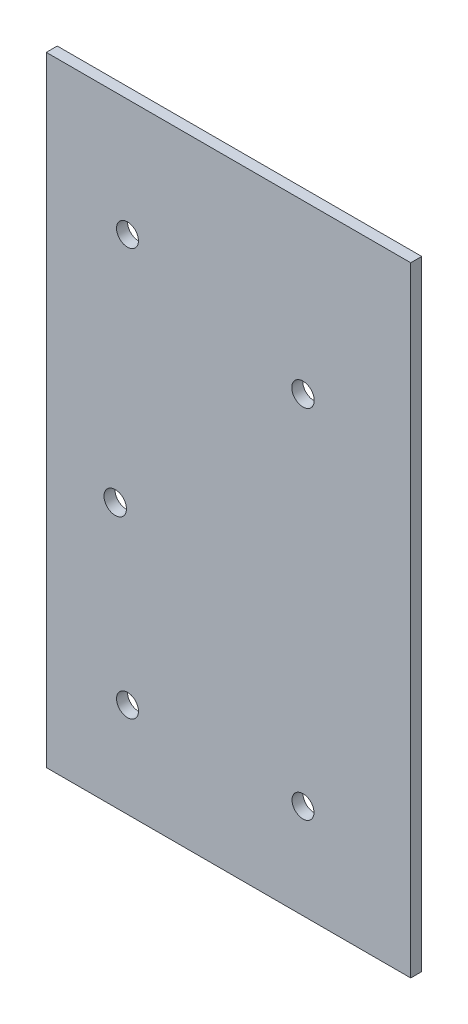
ISO-10303-21;
HEADER;
FILE_DESCRIPTION(('STEP AP214'),'2;1');
FILE_NAME('part.step','',(''),(''),'','','');
FILE_SCHEMA(('AUTOMOTIVE_DESIGN { 1 0 10303 214 1 1 1 1 }'));
ENDSEC;
DATA;
#1=APPLICATION_CONTEXT('core data for automotive mechanical design processes');
#2=APPLICATION_PROTOCOL_DEFINITION('international standard','automotive_design',2000,#1);
#3=PRODUCT_CONTEXT('',#1,'mechanical');
#4=PRODUCT('Part','Part','',(#3));
#5=PRODUCT_RELATED_PRODUCT_CATEGORY('part','',(#4));
#6=PRODUCT_DEFINITION_FORMATION('','',#4);
#7=PRODUCT_DEFINITION_CONTEXT('part definition',#1,'design');
#8=PRODUCT_DEFINITION('design','',#6,#7);
#9=PRODUCT_DEFINITION_SHAPE('','',#8);
#10=(LENGTH_UNIT() NAMED_UNIT(*) SI_UNIT(.MILLI.,.METRE.));
#11=(NAMED_UNIT(*) PLANE_ANGLE_UNIT() SI_UNIT($,.RADIAN.));
#12=(NAMED_UNIT(*) SI_UNIT($,.STERADIAN.) SOLID_ANGLE_UNIT());
#13=UNCERTAINTY_MEASURE_WITH_UNIT(LENGTH_MEASURE(1.E-05),#10,'distance_accuracy_value','');
#14=(GEOMETRIC_REPRESENTATION_CONTEXT(3) GLOBAL_UNCERTAINTY_ASSIGNED_CONTEXT((#13)) GLOBAL_UNIT_ASSIGNED_CONTEXT((#10,
#11,#12)) REPRESENTATION_CONTEXT('',''));
#15=CARTESIAN_POINT('',(0.,0.,0.));
#16=DIRECTION('',(0.,0.,1.));
#17=DIRECTION('',(1.,0.,0.));
#18=AXIS2_PLACEMENT_3D('',#15,#16,#17);
#19=CARTESIAN_POINT('',(0.,0.,3.175));
#20=DIRECTION('',(0.,0.,1.));
#21=DIRECTION('',(1.,0.,0.));
#22=AXIS2_PLACEMENT_3D('',#19,#20,#21);
#23=PLANE('',#22);
#24=CARTESIAN_POINT('',(76.1999999999999,162.306,3.175));
#25=DIRECTION('',(0.,0.,1.));
#26=DIRECTION('',(1.,0.,0.));
#27=AXIS2_PLACEMENT_3D('',#24,#25,#26);
#28=CIRCLE('',#27,3.25119999999999);
#29=CARTESIAN_POINT('',(79.4511999999999,162.306,3.175));
#30=VERTEX_POINT('',#29);
#31=EDGE_CURVE('E133',#30,#30,#28,.T.);
#32=ORIENTED_EDGE('',*,*,#31,.F.);
#33=EDGE_LOOP('',(#32));
#34=FACE_BOUND('',#33,.T.);
#35=CARTESIAN_POINT('',(76.1999999999998,58.9642857142862,3.175));
#36=DIRECTION('',(0.,0.,1.));
#37=DIRECTION('',(1.,0.,0.));
#38=AXIS2_PLACEMENT_3D('',#35,#36,#37);
#39=CIRCLE('',#38,3.175);
#40=CARTESIAN_POINT('',(79.3749999999998,58.9642857142862,3.175));
#41=VERTEX_POINT('',#40);
#42=EDGE_CURVE('E121',#41,#41,#39,.T.);
#43=ORIENTED_EDGE('',*,*,#42,.F.);
#44=EDGE_LOOP('',(#43));
#45=FACE_BOUND('',#44,.T.);
#46=DIRECTION('',(0.,-1.,0.));
#47=VECTOR('',#46,1.);
#48=CARTESIAN_POINT('',(1.88908690790865,210.816126932571,3.175));
#49=LINE('',#48,#47);
#50=CARTESIAN_POINT('',(1.88908690790865,210.816126932571,3.175));
#51=VERTEX_POINT('',#50);
#52=CARTESIAN_POINT('',(1.88908690790868,31.517256692789,3.175));
#53=VERTEX_POINT('',#52);
#54=EDGE_CURVE('E91',#51,#53,#49,.T.);
#55=ORIENTED_EDGE('',*,*,#54,.T.);
#56=DIRECTION('',(1.,0.,0.));
#57=VECTOR('',#56,1.);
#58=CARTESIAN_POINT('',(1.88908690790868,31.517256692789,3.175));
#59=LINE('',#58,#57);
#60=CARTESIAN_POINT('',(107.38691409108,31.517256692789,3.175));
#61=VERTEX_POINT('',#60);
#62=EDGE_CURVE('E86',#53,#61,#59,.T.);
#63=ORIENTED_EDGE('',*,*,#62,.T.);
#64=DIRECTION('',(0.,1.,0.));
#65=VECTOR('',#64,1.);
#66=CARTESIAN_POINT('',(107.38691409108,210.816126932571,3.175));
#67=LINE('',#66,#65);
#68=CARTESIAN_POINT('',(107.38691409108,210.816126932571,3.175));
#69=VERTEX_POINT('',#68);
#70=EDGE_CURVE('E89',#61,#69,#67,.T.);
#71=ORIENTED_EDGE('',*,*,#70,.T.);
#72=DIRECTION('',(-1.,0.,0.));
#73=VECTOR('',#72,1.);
#74=CARTESIAN_POINT('',(1.88908690790865,210.816126932571,3.175));
#75=LINE('',#74,#73);
#76=EDGE_CURVE('E56',#69,#51,#75,.T.);
#77=ORIENTED_EDGE('',*,*,#76,.T.);
#78=EDGE_LOOP('',(#55,#63,#71,#77));
#79=FACE_BOUND('',#78,.T.);
#80=CARTESIAN_POINT('',(25.3999999999998,58.9642857142856,3.175));
#81=DIRECTION('',(0.,0.,1.));
#82=DIRECTION('',(1.,0.,0.));
#83=AXIS2_PLACEMENT_3D('',#80,#81,#82);
#84=CIRCLE('',#83,3.175);
#85=CARTESIAN_POINT('',(28.5749999999998,58.9642857142856,3.175));
#86=VERTEX_POINT('',#85);
#87=EDGE_CURVE('E106',#86,#86,#84,.T.);
#88=ORIENTED_EDGE('',*,*,#87,.F.);
#89=EDGE_LOOP('',(#88));
#90=FACE_BOUND('',#89,.T.);
#91=CARTESIAN_POINT('',(25.3999999999994,176.892857142857,3.175));
#92=DIRECTION('',(0.,0.,1.));
#93=DIRECTION('',(1.,0.,0.));
#94=AXIS2_PLACEMENT_3D('',#91,#92,#93);
#95=CIRCLE('',#94,3.17500000000001);
#96=CARTESIAN_POINT('',(28.5749999999994,176.892857142857,3.175));
#97=VERTEX_POINT('',#96);
#98=EDGE_CURVE('E127',#97,#97,#95,.T.);
#99=ORIENTED_EDGE('',*,*,#98,.F.);
#100=EDGE_LOOP('',(#99));
#101=FACE_BOUND('',#100,.T.);
#102=CARTESIAN_POINT('',(21.8439999999999,107.95,3.175));
#103=DIRECTION('',(0.,0.,1.));
#104=DIRECTION('',(1.,0.,0.));
#105=AXIS2_PLACEMENT_3D('',#102,#103,#104);
#106=CIRCLE('',#105,3.25119999999999);
#107=CARTESIAN_POINT('',(25.0951999999999,107.95,3.175));
#108=VERTEX_POINT('',#107);
#109=EDGE_CURVE('E139',#108,#108,#106,.T.);
#110=ORIENTED_EDGE('',*,*,#109,.F.);
#111=EDGE_LOOP('',(#110));
#112=FACE_BOUND('',#111,.T.);
#113=ADVANCED_FACE('F39',(#34,#45,#79,#90,#101,#112),#23,.T.);
#114=CARTESIAN_POINT('',(0.,0.,0.));
#115=DIRECTION('',(0.,0.,1.));
#116=DIRECTION('',(1.,0.,0.));
#117=AXIS2_PLACEMENT_3D('',#114,#115,#116);
#118=PLANE('',#117);
#119=DIRECTION('',(0.,-1.,0.));
#120=VECTOR('',#119,1.);
#121=CARTESIAN_POINT('',(1.88908690790865,210.816126932571,0.));
#122=LINE('',#121,#120);
#123=CARTESIAN_POINT('',(1.88908690790865,210.816126932571,0.));
#124=VERTEX_POINT('',#123);
#125=CARTESIAN_POINT('',(1.88908690790868,31.517256692789,0.));
#126=VERTEX_POINT('',#125);
#127=EDGE_CURVE('E103',#124,#126,#122,.T.);
#128=ORIENTED_EDGE('',*,*,#127,.F.);
#129=DIRECTION('',(-1.,0.,0.));
#130=VECTOR('',#129,1.);
#131=CARTESIAN_POINT('',(1.88908690790865,210.816126932571,0.));
#132=LINE('',#131,#130);
#133=CARTESIAN_POINT('',(107.38691409108,210.816126932571,0.));
#134=VERTEX_POINT('',#133);
#135=EDGE_CURVE('E79',#134,#124,#132,.T.);
#136=ORIENTED_EDGE('',*,*,#135,.F.);
#137=DIRECTION('',(0.,1.,0.));
#138=VECTOR('',#137,1.);
#139=CARTESIAN_POINT('',(107.38691409108,210.816126932571,0.));
#140=LINE('',#139,#138);
#141=CARTESIAN_POINT('',(107.38691409108,31.517256692789,0.));
#142=VERTEX_POINT('',#141);
#143=EDGE_CURVE('E73',#142,#134,#140,.T.);
#144=ORIENTED_EDGE('',*,*,#143,.F.);
#145=DIRECTION('',(1.,0.,0.));
#146=VECTOR('',#145,1.);
#147=CARTESIAN_POINT('',(1.88908690790868,31.517256692789,0.));
#148=LINE('',#147,#146);
#149=EDGE_CURVE('E95',#126,#142,#148,.T.);
#150=ORIENTED_EDGE('',*,*,#149,.F.);
#151=EDGE_LOOP('',(#128,#136,#144,#150));
#152=FACE_BOUND('',#151,.T.);
#153=CARTESIAN_POINT('',(25.3999999999998,58.9642857142856,0.));
#154=DIRECTION('',(0.,0.,1.));
#155=DIRECTION('',(1.,0.,0.));
#156=AXIS2_PLACEMENT_3D('',#153,#154,#155);
#157=CIRCLE('',#156,3.175);
#158=CARTESIAN_POINT('',(28.5749999999998,58.9642857142856,0.));
#159=VERTEX_POINT('',#158);
#160=EDGE_CURVE('E118',#159,#159,#157,.T.);
#161=ORIENTED_EDGE('',*,*,#160,.T.);
#162=EDGE_LOOP('',(#161));
#163=FACE_BOUND('',#162,.T.);
#164=CARTESIAN_POINT('',(76.1999999999998,58.9642857142862,0.));
#165=DIRECTION('',(0.,0.,1.));
#166=DIRECTION('',(1.,0.,0.));
#167=AXIS2_PLACEMENT_3D('',#164,#165,#166);
#168=CIRCLE('',#167,3.175);
#169=CARTESIAN_POINT('',(79.3749999999998,58.9642857142862,0.));
#170=VERTEX_POINT('',#169);
#171=EDGE_CURVE('E124',#170,#170,#168,.T.);
#172=ORIENTED_EDGE('',*,*,#171,.T.);
#173=EDGE_LOOP('',(#172));
#174=FACE_BOUND('',#173,.T.);
#175=CARTESIAN_POINT('',(25.3999999999994,176.892857142857,0.));
#176=DIRECTION('',(0.,0.,1.));
#177=DIRECTION('',(1.,0.,0.));
#178=AXIS2_PLACEMENT_3D('',#175,#176,#177);
#179=CIRCLE('',#178,3.17500000000001);
#180=CARTESIAN_POINT('',(28.5749999999994,176.892857142857,0.));
#181=VERTEX_POINT('',#180);
#182=EDGE_CURVE('E130',#181,#181,#179,.T.);
#183=ORIENTED_EDGE('',*,*,#182,.T.);
#184=EDGE_LOOP('',(#183));
#185=FACE_BOUND('',#184,.T.);
#186=CARTESIAN_POINT('',(76.1999999999999,162.306,0.));
#187=DIRECTION('',(0.,0.,1.));
#188=DIRECTION('',(1.,0.,0.));
#189=AXIS2_PLACEMENT_3D('',#186,#187,#188);
#190=CIRCLE('',#189,3.25119999999999);
#191=CARTESIAN_POINT('',(79.4511999999999,162.306,0.));
#192=VERTEX_POINT('',#191);
#193=EDGE_CURVE('E136',#192,#192,#190,.T.);
#194=ORIENTED_EDGE('',*,*,#193,.T.);
#195=EDGE_LOOP('',(#194));
#196=FACE_BOUND('',#195,.T.);
#197=CARTESIAN_POINT('',(21.8439999999999,107.95,0.));
#198=DIRECTION('',(0.,0.,1.));
#199=DIRECTION('',(1.,0.,0.));
#200=AXIS2_PLACEMENT_3D('',#197,#198,#199);
#201=CIRCLE('',#200,3.25119999999999);
#202=CARTESIAN_POINT('',(25.0951999999999,107.95,0.));
#203=VERTEX_POINT('',#202);
#204=EDGE_CURVE('E142',#203,#203,#201,.T.);
#205=ORIENTED_EDGE('',*,*,#204,.T.);
#206=EDGE_LOOP('',(#205));
#207=FACE_BOUND('',#206,.T.);
#208=ADVANCED_FACE('F114',(#152,#163,#174,#185,#196,#207),#118,.F.);
#209=CARTESIAN_POINT('',(1.88908690790865,210.816126932571,3.175));
#210=DIRECTION('',(1.,0.,0.));
#211=DIRECTION('',(0.,1.,0.));
#212=AXIS2_PLACEMENT_3D('',#209,#210,#211);
#213=PLANE('',#212);
#214=ORIENTED_EDGE('',*,*,#127,.T.);
#215=DIRECTION('',(0.,0.,-1.));
#216=VECTOR('',#215,1.);
#217=CARTESIAN_POINT('',(1.88908690790868,31.517256692789,3.175));
#218=LINE('',#217,#216);
#219=EDGE_CURVE('E11',#53,#126,#218,.T.);
#220=ORIENTED_EDGE('',*,*,#219,.F.);
#221=ORIENTED_EDGE('',*,*,#54,.F.);
#222=DIRECTION('',(0.,0.,-1.));
#223=VECTOR('',#222,1.);
#224=CARTESIAN_POINT('',(1.88908690790865,210.816126932571,3.175));
#225=LINE('',#224,#223);
#226=EDGE_CURVE('E99',#51,#124,#225,.T.);
#227=ORIENTED_EDGE('',*,*,#226,.T.);
#228=EDGE_LOOP('',(#214,#220,#221,#227));
#229=FACE_BOUND('',#228,.T.);
#230=ADVANCED_FACE('F41',(#229),#213,.F.);
#231=CARTESIAN_POINT('',(1.88908690790868,31.517256692789,3.175));
#232=DIRECTION('',(0.,1.,0.));
#233=DIRECTION('',(0.,0.,1.));
#234=AXIS2_PLACEMENT_3D('',#231,#232,#233);
#235=PLANE('',#234);
#236=ORIENTED_EDGE('',*,*,#149,.T.);
#237=DIRECTION('',(0.,0.,-1.));
#238=VECTOR('',#237,1.);
#239=CARTESIAN_POINT('',(107.38691409108,31.517256692789,3.175));
#240=LINE('',#239,#238);
#241=EDGE_CURVE('E48',#61,#142,#240,.T.);
#242=ORIENTED_EDGE('',*,*,#241,.F.);
#243=ORIENTED_EDGE('',*,*,#62,.F.);
#244=ORIENTED_EDGE('',*,*,#219,.T.);
#245=EDGE_LOOP('',(#236,#242,#243,#244));
#246=FACE_BOUND('',#245,.T.);
#247=ADVANCED_FACE('F94',(#246),#235,.F.);
#248=CARTESIAN_POINT('',(107.38691409108,210.816126932571,3.175));
#249=DIRECTION('',(-1.,0.,0.));
#250=DIRECTION('',(0.,0.,1.));
#251=AXIS2_PLACEMENT_3D('',#248,#249,#250);
#252=PLANE('',#251);
#253=ORIENTED_EDGE('',*,*,#143,.T.);
#254=DIRECTION('',(0.,0.,-1.));
#255=VECTOR('',#254,1.);
#256=CARTESIAN_POINT('',(107.38691409108,210.816126932571,3.175));
#257=LINE('',#256,#255);
#258=EDGE_CURVE('E96',#69,#134,#257,.T.);
#259=ORIENTED_EDGE('',*,*,#258,.F.);
#260=ORIENTED_EDGE('',*,*,#70,.F.);
#261=ORIENTED_EDGE('',*,*,#241,.T.);
#262=EDGE_LOOP('',(#253,#259,#260,#261));
#263=FACE_BOUND('',#262,.T.);
#264=ADVANCED_FACE('F97',(#263),#252,.F.);
#265=CARTESIAN_POINT('',(1.88908690790865,210.816126932571,3.175));
#266=DIRECTION('',(0.,-1.,0.));
#267=DIRECTION('',(0.,0.,-1.));
#268=AXIS2_PLACEMENT_3D('',#265,#266,#267);
#269=PLANE('',#268);
#270=ORIENTED_EDGE('',*,*,#135,.T.);
#271=ORIENTED_EDGE('',*,*,#226,.F.);
#272=ORIENTED_EDGE('',*,*,#76,.F.);
#273=ORIENTED_EDGE('',*,*,#258,.T.);
#274=EDGE_LOOP('',(#270,#271,#272,#273));
#275=FACE_BOUND('',#274,.T.);
#276=ADVANCED_FACE('F111',(#275),#269,.F.);
#277=CARTESIAN_POINT('',(25.3999999999998,58.9642857142856,3.175));
#278=DIRECTION('',(0.,0.,-1.));
#279=DIRECTION('',(-1.,0.,0.));
#280=AXIS2_PLACEMENT_3D('',#277,#278,#279);
#281=CYLINDRICAL_SURFACE('',#280,3.175);
#282=ORIENTED_EDGE('',*,*,#87,.T.);
#283=EDGE_LOOP('',(#282));
#284=FACE_BOUND('',#283,.T.);
#285=ORIENTED_EDGE('',*,*,#160,.F.);
#286=EDGE_LOOP('',(#285));
#287=FACE_BOUND('',#286,.T.);
#288=ADVANCED_FACE('F161',(#284,#287),#281,.F.);
#289=CARTESIAN_POINT('',(76.1999999999998,58.9642857142862,3.175));
#290=DIRECTION('',(0.,0.,-1.));
#291=DIRECTION('',(-1.,0.,0.));
#292=AXIS2_PLACEMENT_3D('',#289,#290,#291);
#293=CYLINDRICAL_SURFACE('',#292,3.175);
#294=ORIENTED_EDGE('',*,*,#42,.T.);
#295=EDGE_LOOP('',(#294));
#296=FACE_BOUND('',#295,.T.);
#297=ORIENTED_EDGE('',*,*,#171,.F.);
#298=EDGE_LOOP('',(#297));
#299=FACE_BOUND('',#298,.T.);
#300=ADVANCED_FACE('F206',(#296,#299),#293,.F.);
#301=CARTESIAN_POINT('',(25.3999999999994,176.892857142857,3.175));
#302=DIRECTION('',(0.,0.,-1.));
#303=DIRECTION('',(-1.,0.,0.));
#304=AXIS2_PLACEMENT_3D('',#301,#302,#303);
#305=CYLINDRICAL_SURFACE('',#304,3.17500000000001);
#306=ORIENTED_EDGE('',*,*,#98,.T.);
#307=EDGE_LOOP('',(#306));
#308=FACE_BOUND('',#307,.T.);
#309=ORIENTED_EDGE('',*,*,#182,.F.);
#310=EDGE_LOOP('',(#309));
#311=FACE_BOUND('',#310,.T.);
#312=ADVANCED_FACE('F214',(#308,#311),#305,.F.);
#313=CARTESIAN_POINT('',(76.1999999999999,162.306,3.175));
#314=DIRECTION('',(0.,0.,-1.));
#315=DIRECTION('',(-1.,0.,0.));
#316=AXIS2_PLACEMENT_3D('',#313,#314,#315);
#317=CYLINDRICAL_SURFACE('',#316,3.25119999999999);
#318=ORIENTED_EDGE('',*,*,#31,.T.);
#319=EDGE_LOOP('',(#318));
#320=FACE_BOUND('',#319,.T.);
#321=ORIENTED_EDGE('',*,*,#193,.F.);
#322=EDGE_LOOP('',(#321));
#323=FACE_BOUND('',#322,.T.);
#324=ADVANCED_FACE('F222',(#320,#323),#317,.F.);
#325=CARTESIAN_POINT('',(21.8439999999999,107.95,3.175));
#326=DIRECTION('',(0.,0.,-1.));
#327=DIRECTION('',(-1.,0.,0.));
#328=AXIS2_PLACEMENT_3D('',#325,#326,#327);
#329=CYLINDRICAL_SURFACE('',#328,3.25119999999999);
#330=ORIENTED_EDGE('',*,*,#109,.T.);
#331=EDGE_LOOP('',(#330));
#332=FACE_BOUND('',#331,.T.);
#333=ORIENTED_EDGE('',*,*,#204,.F.);
#334=EDGE_LOOP('',(#333));
#335=FACE_BOUND('',#334,.T.);
#336=ADVANCED_FACE('F148',(#332,#335),#329,.F.);
#337=CLOSED_SHELL('',(#113,#208,#230,#247,#264,#276,#288,#300,#312,#324,#336));
#338=MANIFOLD_SOLID_BREP('B2',#337);
#339=ADVANCED_BREP_SHAPE_REPRESENTATION('',(#18,#338),#14);
#340=SHAPE_DEFINITION_REPRESENTATION(#9,#339);
ENDSEC;
END-ISO-10303-21;
